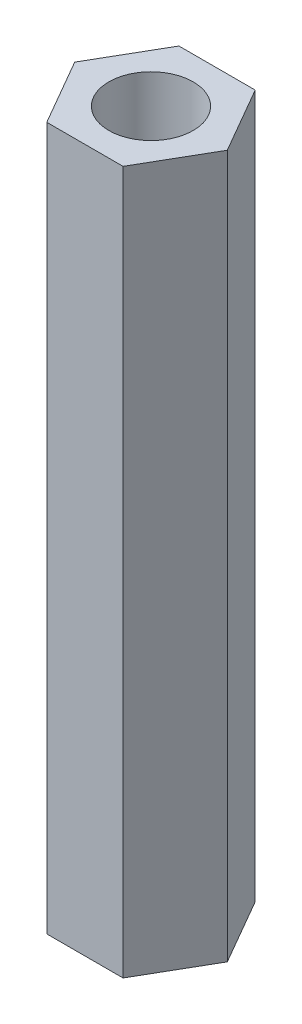
ISO-10303-21;
HEADER;
FILE_DESCRIPTION(('STEP AP214'),'2;1');
FILE_NAME('part.step','',(''),(''),'','','');
FILE_SCHEMA(('AUTOMOTIVE_DESIGN { 1 0 10303 214 1 1 1 1 }'));
ENDSEC;
DATA;
#1=APPLICATION_CONTEXT('core data for automotive mechanical design processes');
#2=APPLICATION_PROTOCOL_DEFINITION('international standard','automotive_design',2000,#1);
#3=PRODUCT_CONTEXT('',#1,'mechanical');
#4=PRODUCT('Part','Part','',(#3));
#5=PRODUCT_RELATED_PRODUCT_CATEGORY('part','',(#4));
#6=PRODUCT_DEFINITION_FORMATION('','',#4);
#7=PRODUCT_DEFINITION_CONTEXT('part definition',#1,'design');
#8=PRODUCT_DEFINITION('design','',#6,#7);
#9=PRODUCT_DEFINITION_SHAPE('','',#8);
#10=(LENGTH_UNIT() NAMED_UNIT(*) SI_UNIT(.MILLI.,.METRE.));
#11=(NAMED_UNIT(*) PLANE_ANGLE_UNIT() SI_UNIT($,.RADIAN.));
#12=(NAMED_UNIT(*) SI_UNIT($,.STERADIAN.) SOLID_ANGLE_UNIT());
#13=UNCERTAINTY_MEASURE_WITH_UNIT(LENGTH_MEASURE(1.E-05),#10,'distance_accuracy_value','');
#14=(GEOMETRIC_REPRESENTATION_CONTEXT(3) GLOBAL_UNCERTAINTY_ASSIGNED_CONTEXT((#13)) GLOBAL_UNIT_ASSIGNED_CONTEXT((#10,
#11,#12)) REPRESENTATION_CONTEXT('',''));
#15=CARTESIAN_POINT('',(0.,0.,0.));
#16=DIRECTION('',(0.,0.,1.));
#17=DIRECTION('',(1.,0.,0.));
#18=AXIS2_PLACEMENT_3D('',#15,#16,#17);
#19=CARTESIAN_POINT('',(0.,25.,0.));
#20=DIRECTION('',(0.,1.,0.));
#21=DIRECTION('',(0.,0.,1.));
#22=AXIS2_PLACEMENT_3D('',#19,#20,#21);
#23=PLANE('',#22);
#24=DIRECTION('',(1.,0.,0.));
#25=VECTOR('',#24,1.);
#26=CARTESIAN_POINT('',(-1.35677313259562,25.,2.35));
#27=LINE('',#26,#25);
#28=CARTESIAN_POINT('',(-1.35677313259562,25.,2.35));
#29=VERTEX_POINT('',#28);
#30=CARTESIAN_POINT('',(1.35677313259562,25.,2.35));
#31=VERTEX_POINT('',#30);
#32=EDGE_CURVE('E135',#29,#31,#27,.T.);
#33=ORIENTED_EDGE('',*,*,#32,.T.);
#34=DIRECTION('',(0.499999999999999,0.,-0.866025403784439));
#35=VECTOR('',#34,1.);
#36=CARTESIAN_POINT('',(1.35677313259562,25.,2.35));
#37=LINE('',#36,#35);
#38=CARTESIAN_POINT('',(2.71354626519124,25.,0.));
#39=VERTEX_POINT('',#38);
#40=EDGE_CURVE('E93',#31,#39,#37,.T.);
#41=ORIENTED_EDGE('',*,*,#40,.T.);
#42=DIRECTION('',(-0.5,0.,-0.866025403784439));
#43=VECTOR('',#42,1.);
#44=CARTESIAN_POINT('',(2.71354626519124,25.,0.));
#45=LINE('',#44,#43);
#46=CARTESIAN_POINT('',(1.35677313259562,25.,-2.35));
#47=VERTEX_POINT('',#46);
#48=EDGE_CURVE('E106',#39,#47,#45,.T.);
#49=ORIENTED_EDGE('',*,*,#48,.T.);
#50=DIRECTION('',(-1.,0.,0.));
#51=VECTOR('',#50,1.);
#52=CARTESIAN_POINT('',(1.35677313259562,25.,-2.35));
#53=LINE('',#52,#51);
#54=CARTESIAN_POINT('',(-1.35677313259562,25.,-2.35));
#55=VERTEX_POINT('',#54);
#56=EDGE_CURVE('E100',#47,#55,#53,.T.);
#57=ORIENTED_EDGE('',*,*,#56,.T.);
#58=DIRECTION('',(-0.499999999999999,0.,0.866025403784439));
#59=VECTOR('',#58,1.);
#60=CARTESIAN_POINT('',(-1.35677313259562,25.,-2.35));
#61=LINE('',#60,#59);
#62=CARTESIAN_POINT('',(-2.71354626519124,25.,0.));
#63=VERTEX_POINT('',#62);
#64=EDGE_CURVE('E104',#55,#63,#61,.T.);
#65=ORIENTED_EDGE('',*,*,#64,.T.);
#66=DIRECTION('',(0.499999999999999,0.,0.866025403784439));
#67=VECTOR('',#66,1.);
#68=CARTESIAN_POINT('',(-2.71354626519124,25.,0.));
#69=LINE('',#68,#67);
#70=EDGE_CURVE('E56',#63,#29,#69,.T.);
#71=ORIENTED_EDGE('',*,*,#70,.T.);
#72=EDGE_LOOP('',(#33,#41,#49,#57,#65,#71));
#73=FACE_BOUND('',#72,.T.);
#74=CARTESIAN_POINT('',(0.,25.,0.));
#75=DIRECTION('',(0.,1.,0.));
#76=DIRECTION('',(0.,0.,1.));
#77=AXIS2_PLACEMENT_3D('',#74,#75,#76);
#78=CIRCLE('',#77,1.5);
#79=CARTESIAN_POINT('',(0.,25.,1.5));
#80=VERTEX_POINT('',#79);
#81=EDGE_CURVE('E128',#80,#80,#78,.T.);
#82=ORIENTED_EDGE('',*,*,#81,.F.);
#83=EDGE_LOOP('',(#82));
#84=FACE_BOUND('',#83,.T.);
#85=ADVANCED_FACE('F39',(#73,#84),#23,.T.);
#86=CARTESIAN_POINT('',(0.,0.,0.));
#87=DIRECTION('',(0.,1.,0.));
#88=DIRECTION('',(0.,0.,1.));
#89=AXIS2_PLACEMENT_3D('',#86,#87,#88);
#90=PLANE('',#89);
#91=DIRECTION('',(1.,0.,0.));
#92=VECTOR('',#91,1.);
#93=CARTESIAN_POINT('',(-1.35677313259562,0.,2.35));
#94=LINE('',#93,#92);
#95=CARTESIAN_POINT('',(-1.35677313259562,0.,2.35));
#96=VERTEX_POINT('',#95);
#97=CARTESIAN_POINT('',(1.35677313259562,0.,2.35));
#98=VERTEX_POINT('',#97);
#99=EDGE_CURVE('E124',#96,#98,#94,.T.);
#100=ORIENTED_EDGE('',*,*,#99,.F.);
#101=DIRECTION('',(0.499999999999999,0.,0.866025403784439));
#102=VECTOR('',#101,1.);
#103=CARTESIAN_POINT('',(-2.71354626519124,0.,0.));
#104=LINE('',#103,#102);
#105=CARTESIAN_POINT('',(-2.71354626519124,0.,0.));
#106=VERTEX_POINT('',#105);
#107=EDGE_CURVE('E85',#106,#96,#104,.T.);
#108=ORIENTED_EDGE('',*,*,#107,.F.);
#109=DIRECTION('',(-0.499999999999999,0.,0.866025403784439));
#110=VECTOR('',#109,1.);
#111=CARTESIAN_POINT('',(-1.35677313259562,0.,-2.35));
#112=LINE('',#111,#110);
#113=CARTESIAN_POINT('',(-1.35677313259562,0.,-2.35));
#114=VERTEX_POINT('',#113);
#115=EDGE_CURVE('E79',#114,#106,#112,.T.);
#116=ORIENTED_EDGE('',*,*,#115,.F.);
#117=DIRECTION('',(-1.,0.,0.));
#118=VECTOR('',#117,1.);
#119=CARTESIAN_POINT('',(1.35677313259562,0.,-2.35));
#120=LINE('',#119,#118);
#121=CARTESIAN_POINT('',(1.35677313259562,0.,-2.35));
#122=VERTEX_POINT('',#121);
#123=EDGE_CURVE('E114',#122,#114,#120,.T.);
#124=ORIENTED_EDGE('',*,*,#123,.F.);
#125=DIRECTION('',(-0.5,0.,-0.866025403784439));
#126=VECTOR('',#125,1.);
#127=CARTESIAN_POINT('',(2.71354626519124,0.,0.));
#128=LINE('',#127,#126);
#129=CARTESIAN_POINT('',(2.71354626519124,0.,0.));
#130=VERTEX_POINT('',#129);
#131=EDGE_CURVE('E130',#130,#122,#128,.T.);
#132=ORIENTED_EDGE('',*,*,#131,.F.);
#133=DIRECTION('',(0.499999999999999,0.,-0.866025403784439));
#134=VECTOR('',#133,1.);
#135=CARTESIAN_POINT('',(1.35677313259562,0.,2.35));
#136=LINE('',#135,#134);
#137=EDGE_CURVE('E127',#98,#130,#136,.T.);
#138=ORIENTED_EDGE('',*,*,#137,.F.);
#139=EDGE_LOOP('',(#100,#108,#116,#124,#132,#138));
#140=FACE_BOUND('',#139,.T.);
#141=CARTESIAN_POINT('',(0.,0.,0.));
#142=DIRECTION('',(0.,1.,0.));
#143=DIRECTION('',(0.,0.,1.));
#144=AXIS2_PLACEMENT_3D('',#141,#142,#143);
#145=CIRCLE('',#144,1.5);
#146=CARTESIAN_POINT('',(0.,0.,1.5));
#147=VERTEX_POINT('',#146);
#148=EDGE_CURVE('E246',#147,#147,#145,.T.);
#149=ORIENTED_EDGE('',*,*,#148,.T.);
#150=EDGE_LOOP('',(#149));
#151=FACE_BOUND('',#150,.T.);
#152=ADVANCED_FACE('F144',(#140,#151),#90,.F.);
#153=CARTESIAN_POINT('',(-1.35677313259562,25.,2.35));
#154=DIRECTION('',(0.,0.,-1.));
#155=DIRECTION('',(-1.,0.,0.));
#156=AXIS2_PLACEMENT_3D('',#153,#154,#155);
#157=PLANE('',#156);
#158=ORIENTED_EDGE('',*,*,#99,.T.);
#159=DIRECTION('',(0.,-1.,0.));
#160=VECTOR('',#159,1.);
#161=CARTESIAN_POINT('',(1.35677313259562,25.,2.35));
#162=LINE('',#161,#160);
#163=EDGE_CURVE('E11',#31,#98,#162,.T.);
#164=ORIENTED_EDGE('',*,*,#163,.F.);
#165=ORIENTED_EDGE('',*,*,#32,.F.);
#166=DIRECTION('',(0.,-1.,0.));
#167=VECTOR('',#166,1.);
#168=CARTESIAN_POINT('',(-1.35677313259562,25.,2.35));
#169=LINE('',#168,#167);
#170=EDGE_CURVE('E120',#29,#96,#169,.T.);
#171=ORIENTED_EDGE('',*,*,#170,.T.);
#172=EDGE_LOOP('',(#158,#164,#165,#171));
#173=FACE_BOUND('',#172,.T.);
#174=ADVANCED_FACE('F41',(#173),#157,.F.);
#175=CARTESIAN_POINT('',(1.35677313259562,25.,2.35));
#176=DIRECTION('',(-0.866025403784439,0.,-0.499999999999999));
#177=DIRECTION('',(-0.499999999999999,0.,0.866025403784439));
#178=AXIS2_PLACEMENT_3D('',#175,#176,#177);
#179=PLANE('',#178);
#180=ORIENTED_EDGE('',*,*,#137,.T.);
#181=DIRECTION('',(0.,-1.,0.));
#182=VECTOR('',#181,1.);
#183=CARTESIAN_POINT('',(2.71354626519124,25.,0.));
#184=LINE('',#183,#182);
#185=EDGE_CURVE('E48',#39,#130,#184,.T.);
#186=ORIENTED_EDGE('',*,*,#185,.F.);
#187=ORIENTED_EDGE('',*,*,#40,.F.);
#188=ORIENTED_EDGE('',*,*,#163,.T.);
#189=EDGE_LOOP('',(#180,#186,#187,#188));
#190=FACE_BOUND('',#189,.T.);
#191=ADVANCED_FACE('F169',(#190),#179,.F.);
#192=CARTESIAN_POINT('',(2.71354626519124,25.,0.));
#193=DIRECTION('',(-0.866025403784439,0.,0.5));
#194=DIRECTION('',(0.5,0.,0.866025403784439));
#195=AXIS2_PLACEMENT_3D('',#192,#193,#194);
#196=PLANE('',#195);
#197=ORIENTED_EDGE('',*,*,#131,.T.);
#198=DIRECTION('',(0.,-1.,0.));
#199=VECTOR('',#198,1.);
#200=CARTESIAN_POINT('',(1.35677313259562,25.,-2.35));
#201=LINE('',#200,#199);
#202=EDGE_CURVE('E115',#47,#122,#201,.T.);
#203=ORIENTED_EDGE('',*,*,#202,.F.);
#204=ORIENTED_EDGE('',*,*,#48,.F.);
#205=ORIENTED_EDGE('',*,*,#185,.T.);
#206=EDGE_LOOP('',(#197,#203,#204,#205));
#207=FACE_BOUND('',#206,.T.);
#208=ADVANCED_FACE('F141',(#207),#196,.F.);
#209=CARTESIAN_POINT('',(1.35677313259562,25.,-2.35));
#210=DIRECTION('',(0.,0.,1.));
#211=DIRECTION('',(1.,0.,0.));
#212=AXIS2_PLACEMENT_3D('',#209,#210,#211);
#213=PLANE('',#212);
#214=ORIENTED_EDGE('',*,*,#123,.T.);
#215=DIRECTION('',(0.,-1.,0.));
#216=VECTOR('',#215,1.);
#217=CARTESIAN_POINT('',(-1.35677313259562,25.,-2.35));
#218=LINE('',#217,#216);
#219=EDGE_CURVE('E111',#55,#114,#218,.T.);
#220=ORIENTED_EDGE('',*,*,#219,.F.);
#221=ORIENTED_EDGE('',*,*,#56,.F.);
#222=ORIENTED_EDGE('',*,*,#202,.T.);
#223=EDGE_LOOP('',(#214,#220,#221,#222));
#224=FACE_BOUND('',#223,.T.);
#225=ADVANCED_FACE('F112',(#224),#213,.F.);
#226=CARTESIAN_POINT('',(-1.35677313259562,25.,-2.35));
#227=DIRECTION('',(0.866025403784439,0.,0.499999999999999));
#228=DIRECTION('',(0.499999999999999,0.,-0.866025403784439));
#229=AXIS2_PLACEMENT_3D('',#226,#227,#228);
#230=PLANE('',#229);
#231=ORIENTED_EDGE('',*,*,#115,.T.);
#232=DIRECTION('',(0.,-1.,0.));
#233=VECTOR('',#232,1.);
#234=CARTESIAN_POINT('',(-2.71354626519124,25.,0.));
#235=LINE('',#234,#233);
#236=EDGE_CURVE('E116',#63,#106,#235,.T.);
#237=ORIENTED_EDGE('',*,*,#236,.F.);
#238=ORIENTED_EDGE('',*,*,#64,.F.);
#239=ORIENTED_EDGE('',*,*,#219,.T.);
#240=EDGE_LOOP('',(#231,#237,#238,#239));
#241=FACE_BOUND('',#240,.T.);
#242=ADVANCED_FACE('F118',(#241),#230,.F.);
#243=CARTESIAN_POINT('',(-2.71354626519124,25.,0.));
#244=DIRECTION('',(0.866025403784439,0.,-0.499999999999999));
#245=DIRECTION('',(-0.499999999999999,0.,-0.866025403784439));
#246=AXIS2_PLACEMENT_3D('',#243,#244,#245);
#247=PLANE('',#246);
#248=ORIENTED_EDGE('',*,*,#107,.T.);
#249=ORIENTED_EDGE('',*,*,#170,.F.);
#250=ORIENTED_EDGE('',*,*,#70,.F.);
#251=ORIENTED_EDGE('',*,*,#236,.T.);
#252=EDGE_LOOP('',(#248,#249,#250,#251));
#253=FACE_BOUND('',#252,.T.);
#254=ADVANCED_FACE('F149',(#253),#247,.F.);
#255=CARTESIAN_POINT('',(0.,25.,0.));
#256=DIRECTION('',(0.,-1.,0.));
#257=DIRECTION('',(0.,0.,-1.));
#258=AXIS2_PLACEMENT_3D('',#255,#256,#257);
#259=CYLINDRICAL_SURFACE('',#258,1.5);
#260=ORIENTED_EDGE('',*,*,#81,.T.);
#261=EDGE_LOOP('',(#260));
#262=FACE_BOUND('',#261,.T.);
#263=ORIENTED_EDGE('',*,*,#148,.F.);
#264=EDGE_LOOP('',(#263));
#265=FACE_BOUND('',#264,.T.);
#266=ADVANCED_FACE('F151',(#262,#265),#259,.F.);
#267=CLOSED_SHELL('',(#85,#152,#174,#191,#208,#225,#242,#254,#266));
#268=MANIFOLD_SOLID_BREP('B2',#267);
#269=ADVANCED_BREP_SHAPE_REPRESENTATION('',(#18,#268),#14);
#270=SHAPE_DEFINITION_REPRESENTATION(#9,#269);
ENDSEC;
END-ISO-10303-21;
